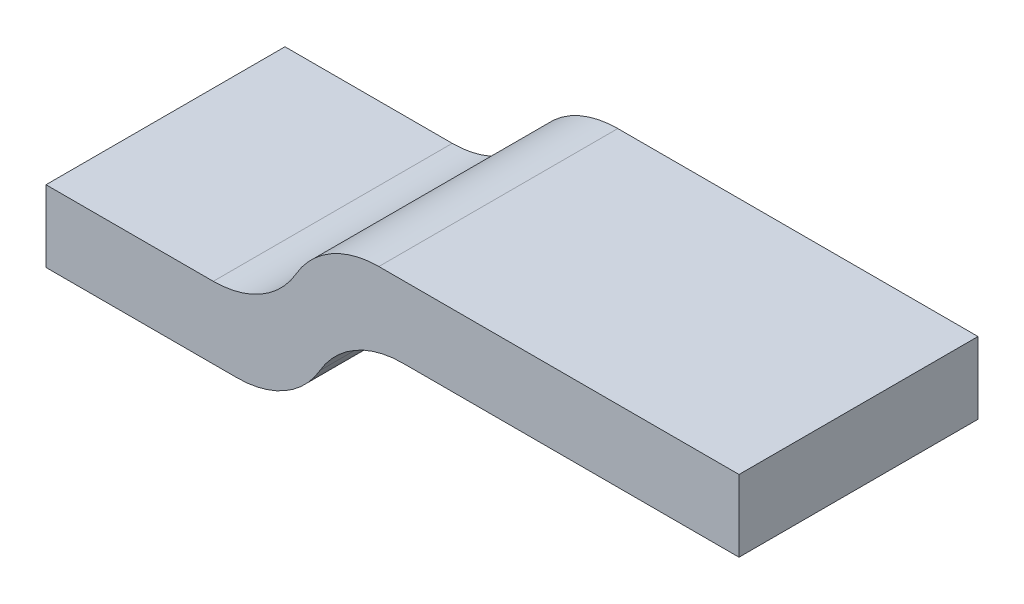
ISO-10303-21;
HEADER;
FILE_DESCRIPTION(('STEP AP214'),'2;1');
FILE_NAME('part.step','',(''),(''),'','','');
FILE_SCHEMA(('AUTOMOTIVE_DESIGN { 1 0 10303 214 1 1 1 1 }'));
ENDSEC;
DATA;
#1=APPLICATION_CONTEXT('core data for automotive mechanical design processes');
#2=APPLICATION_PROTOCOL_DEFINITION('international standard','automotive_design',2000,#1);
#3=PRODUCT_CONTEXT('',#1,'mechanical');
#4=PRODUCT('Part','Part','',(#3));
#5=PRODUCT_RELATED_PRODUCT_CATEGORY('part','',(#4));
#6=PRODUCT_DEFINITION_FORMATION('','',#4);
#7=PRODUCT_DEFINITION_CONTEXT('part definition',#1,'design');
#8=PRODUCT_DEFINITION('design','',#6,#7);
#9=PRODUCT_DEFINITION_SHAPE('','',#8);
#10=(LENGTH_UNIT() NAMED_UNIT(*) SI_UNIT(.MILLI.,.METRE.));
#11=(NAMED_UNIT(*) PLANE_ANGLE_UNIT() SI_UNIT($,.RADIAN.));
#12=(NAMED_UNIT(*) SI_UNIT($,.STERADIAN.) SOLID_ANGLE_UNIT());
#13=UNCERTAINTY_MEASURE_WITH_UNIT(LENGTH_MEASURE(1.E-05),#10,'distance_accuracy_value','');
#14=(GEOMETRIC_REPRESENTATION_CONTEXT(3) GLOBAL_UNCERTAINTY_ASSIGNED_CONTEXT((#13)) GLOBAL_UNIT_ASSIGNED_CONTEXT((#10,
#11,#12)) REPRESENTATION_CONTEXT('',''));
#15=CARTESIAN_POINT('',(0.,0.,0.));
#16=DIRECTION('',(0.,0.,1.));
#17=DIRECTION('',(1.,0.,0.));
#18=AXIS2_PLACEMENT_3D('',#15,#16,#17);
#19=CARTESIAN_POINT('',(-1.75,0.35,-1.6));
#20=DIRECTION('',(0.,-1.,0.));
#21=DIRECTION('',(0.,0.,-1.));
#22=AXIS2_PLACEMENT_3D('',#19,#20,#21);
#23=PLANE('',#22);
#24=DIRECTION('',(-1.,0.,0.));
#25=VECTOR('',#24,1.);
#26=CARTESIAN_POINT('',(-1.75,0.35,-2.1));
#27=LINE('',#26,#25);
#28=CARTESIAN_POINT('',(-1.75,0.35,-2.1));
#29=VERTEX_POINT('',#28);
#30=CARTESIAN_POINT('',(-2.50358983848623,0.35,-2.1));
#31=VERTEX_POINT('',#30);
#32=EDGE_CURVE('E11',#29,#31,#27,.T.);
#33=ORIENTED_EDGE('',*,*,#32,.T.);
#34=DIRECTION('',(0.,0.,-1.));
#35=VECTOR('',#34,1.);
#36=CARTESIAN_POINT('',(-2.50358983848623,0.35,-1.6));
#37=LINE('',#36,#35);
#38=CARTESIAN_POINT('',(-2.50358983848623,0.35,-1.6));
#39=VERTEX_POINT('',#38);
#40=EDGE_CURVE('E24',#39,#31,#37,.T.);
#41=ORIENTED_EDGE('',*,*,#40,.F.);
#42=DIRECTION('',(-1.,0.,0.));
#43=VECTOR('',#42,1.);
#44=CARTESIAN_POINT('',(-1.75,0.35,-1.6));
#45=LINE('',#44,#43);
#46=CARTESIAN_POINT('',(-1.75,0.35,-1.6));
#47=VERTEX_POINT('',#46);
#48=EDGE_CURVE('E171',#47,#39,#45,.T.);
#49=ORIENTED_EDGE('',*,*,#48,.F.);
#50=DIRECTION('',(0.,0.,-1.));
#51=VECTOR('',#50,1.);
#52=CARTESIAN_POINT('',(-1.75,0.35,-1.6));
#53=LINE('',#52,#51);
#54=EDGE_CURVE('E113',#47,#29,#53,.T.);
#55=ORIENTED_EDGE('',*,*,#54,.T.);
#56=EDGE_LOOP('',(#33,#41,#49,#55));
#57=FACE_BOUND('',#56,.T.);
#58=ADVANCED_FACE('F17',(#57),#23,.F.);
#59=CARTESIAN_POINT('',(-2.50358983848623,0.15,-1.6));
#60=DIRECTION('',(0.,0.,-1.));
#61=DIRECTION('',(-1.,0.,0.));
#62=AXIS2_PLACEMENT_3D('',#59,#60,#61);
#63=CYLINDRICAL_SURFACE('',#62,0.2);
#64=CARTESIAN_POINT('',(-2.50358983848623,0.15,-2.1));
#65=DIRECTION('',(0.,0.,1.));
#66=DIRECTION('',(1.,0.,0.));
#67=AXIS2_PLACEMENT_3D('',#64,#65,#66);
#68=CIRCLE('',#67,0.2);
#69=CARTESIAN_POINT('',(-2.67679491924312,0.25,-2.1));
#70=VERTEX_POINT('',#69);
#71=EDGE_CURVE('E168',#31,#70,#68,.T.);
#72=ORIENTED_EDGE('',*,*,#71,.T.);
#73=DIRECTION('',(0.,0.,-1.));
#74=VECTOR('',#73,1.);
#75=CARTESIAN_POINT('',(-2.67679491924312,0.25,-1.6));
#76=LINE('',#75,#74);
#77=CARTESIAN_POINT('',(-2.67679491924312,0.25,-1.6));
#78=VERTEX_POINT('',#77);
#79=EDGE_CURVE('E165',#78,#70,#76,.T.);
#80=ORIENTED_EDGE('',*,*,#79,.F.);
#81=CARTESIAN_POINT('',(-2.50358983848623,0.15,-1.6));
#82=DIRECTION('',(0.,0.,1.));
#83=DIRECTION('',(1.,0.,0.));
#84=AXIS2_PLACEMENT_3D('',#81,#82,#83);
#85=CIRCLE('',#84,0.2);
#86=EDGE_CURVE('E162',#39,#78,#85,.T.);
#87=ORIENTED_EDGE('',*,*,#86,.F.);
#88=ORIENTED_EDGE('',*,*,#40,.T.);
#89=EDGE_LOOP('',(#72,#80,#87,#88));
#90=FACE_BOUND('',#89,.T.);
#91=ADVANCED_FACE('F174',(#90),#63,.T.);
#92=CARTESIAN_POINT('',(-2.85,0.35,-1.6));
#93=DIRECTION('',(0.,0.,-1.));
#94=DIRECTION('',(-1.,0.,0.));
#95=AXIS2_PLACEMENT_3D('',#92,#93,#94);
#96=CYLINDRICAL_SURFACE('',#95,0.2);
#97=CARTESIAN_POINT('',(-2.85,0.35,-2.1));
#98=DIRECTION('',(0.,0.,-1.));
#99=DIRECTION('',(1.,0.,0.));
#100=AXIS2_PLACEMENT_3D('',#97,#98,#99);
#101=CIRCLE('',#100,0.2);
#102=CARTESIAN_POINT('',(-2.85,0.15,-2.1));
#103=VERTEX_POINT('',#102);
#104=EDGE_CURVE('E159',#70,#103,#101,.T.);
#105=ORIENTED_EDGE('',*,*,#104,.T.);
#106=DIRECTION('',(0.,0.,-1.));
#107=VECTOR('',#106,1.);
#108=CARTESIAN_POINT('',(-2.85,0.15,-1.6));
#109=LINE('',#108,#107);
#110=CARTESIAN_POINT('',(-2.85,0.15,-1.6));
#111=VERTEX_POINT('',#110);
#112=EDGE_CURVE('E157',#111,#103,#109,.T.);
#113=ORIENTED_EDGE('',*,*,#112,.F.);
#114=CARTESIAN_POINT('',(-2.85,0.35,-1.6));
#115=DIRECTION('',(0.,0.,-1.));
#116=DIRECTION('',(1.,0.,0.));
#117=AXIS2_PLACEMENT_3D('',#114,#115,#116);
#118=CIRCLE('',#117,0.2);
#119=EDGE_CURVE('E155',#78,#111,#118,.T.);
#120=ORIENTED_EDGE('',*,*,#119,.F.);
#121=ORIENTED_EDGE('',*,*,#79,.T.);
#122=EDGE_LOOP('',(#105,#113,#120,#121));
#123=FACE_BOUND('',#122,.T.);
#124=ADVANCED_FACE('F181',(#123),#96,.F.);
#125=CARTESIAN_POINT('',(-3.2,0.15,-1.6));
#126=DIRECTION('',(0.,-1.,0.));
#127=DIRECTION('',(0.,0.,-1.));
#128=AXIS2_PLACEMENT_3D('',#125,#126,#127);
#129=PLANE('',#128);
#130=DIRECTION('',(-1.,0.,0.));
#131=VECTOR('',#130,1.);
#132=CARTESIAN_POINT('',(-3.2,0.15,-2.1));
#133=LINE('',#132,#131);
#134=CARTESIAN_POINT('',(-3.2,0.15,-2.1));
#135=VERTEX_POINT('',#134);
#136=EDGE_CURVE('E153',#103,#135,#133,.T.);
#137=ORIENTED_EDGE('',*,*,#136,.T.);
#138=DIRECTION('',(0.,0.,-1.));
#139=VECTOR('',#138,1.);
#140=CARTESIAN_POINT('',(-3.2,0.15,-1.6));
#141=LINE('',#140,#139);
#142=CARTESIAN_POINT('',(-3.2,0.15,-1.6));
#143=VERTEX_POINT('',#142);
#144=EDGE_CURVE('E150',#143,#135,#141,.T.);
#145=ORIENTED_EDGE('',*,*,#144,.F.);
#146=DIRECTION('',(-1.,0.,0.));
#147=VECTOR('',#146,1.);
#148=CARTESIAN_POINT('',(-3.2,0.15,-1.6));
#149=LINE('',#148,#147);
#150=EDGE_CURVE('E147',#111,#143,#149,.T.);
#151=ORIENTED_EDGE('',*,*,#150,.F.);
#152=ORIENTED_EDGE('',*,*,#112,.T.);
#153=EDGE_LOOP('',(#137,#145,#151,#152));
#154=FACE_BOUND('',#153,.T.);
#155=ADVANCED_FACE('F199',(#154),#129,.F.);
#156=CARTESIAN_POINT('',(-3.2,0.15,-1.6));
#157=DIRECTION('',(1.,0.,0.));
#158=DIRECTION('',(0.,1.,0.));
#159=AXIS2_PLACEMENT_3D('',#156,#157,#158);
#160=PLANE('',#159);
#161=DIRECTION('',(0.,-1.,0.));
#162=VECTOR('',#161,1.);
#163=CARTESIAN_POINT('',(-3.2,0.15,-2.1));
#164=LINE('',#163,#162);
#165=CARTESIAN_POINT('',(-3.2,0.,-2.1));
#166=VERTEX_POINT('',#165);
#167=EDGE_CURVE('E145',#135,#166,#164,.T.);
#168=ORIENTED_EDGE('',*,*,#167,.T.);
#169=DIRECTION('',(0.,0.,-1.));
#170=VECTOR('',#169,1.);
#171=CARTESIAN_POINT('',(-3.2,0.,-1.6));
#172=LINE('',#171,#170);
#173=CARTESIAN_POINT('',(-3.2,0.,-1.6));
#174=VERTEX_POINT('',#173);
#175=EDGE_CURVE('E142',#174,#166,#172,.T.);
#176=ORIENTED_EDGE('',*,*,#175,.F.);
#177=DIRECTION('',(0.,-1.,0.));
#178=VECTOR('',#177,1.);
#179=CARTESIAN_POINT('',(-3.2,0.15,-1.6));
#180=LINE('',#179,#178);
#181=EDGE_CURVE('E139',#143,#174,#180,.T.);
#182=ORIENTED_EDGE('',*,*,#181,.F.);
#183=ORIENTED_EDGE('',*,*,#144,.T.);
#184=EDGE_LOOP('',(#168,#176,#182,#183));
#185=FACE_BOUND('',#184,.T.);
#186=ADVANCED_FACE('F197',(#185),#160,.F.);
#187=CARTESIAN_POINT('',(-3.2,0.,-1.6));
#188=DIRECTION('',(0.,1.,0.));
#189=DIRECTION('',(1.,0.,0.));
#190=AXIS2_PLACEMENT_3D('',#187,#188,#189);
#191=PLANE('',#190);
#192=DIRECTION('',(1.,0.,0.));
#193=VECTOR('',#192,1.);
#194=CARTESIAN_POINT('',(-3.2,0.,-2.1));
#195=LINE('',#194,#193);
#196=CARTESIAN_POINT('',(-2.8,0.,-2.1));
#197=VERTEX_POINT('',#196);
#198=EDGE_CURVE('E137',#166,#197,#195,.T.);
#199=ORIENTED_EDGE('',*,*,#198,.T.);
#200=DIRECTION('',(0.,0.,-1.));
#201=VECTOR('',#200,1.);
#202=CARTESIAN_POINT('',(-2.8,0.,-1.6));
#203=LINE('',#202,#201);
#204=CARTESIAN_POINT('',(-2.8,0.,-1.6));
#205=VERTEX_POINT('',#204);
#206=EDGE_CURVE('E134',#205,#197,#203,.T.);
#207=ORIENTED_EDGE('',*,*,#206,.F.);
#208=DIRECTION('',(1.,0.,0.));
#209=VECTOR('',#208,1.);
#210=CARTESIAN_POINT('',(-3.2,0.,-1.6));
#211=LINE('',#210,#209);
#212=EDGE_CURVE('E131',#174,#205,#211,.T.);
#213=ORIENTED_EDGE('',*,*,#212,.F.);
#214=ORIENTED_EDGE('',*,*,#175,.T.);
#215=EDGE_LOOP('',(#199,#207,#213,#214));
#216=FACE_BOUND('',#215,.T.);
#217=ADVANCED_FACE('F195',(#216),#191,.F.);
#218=CARTESIAN_POINT('',(-2.8,0.2,-1.6));
#219=DIRECTION('',(0.,0.,-1.));
#220=DIRECTION('',(-1.,0.,0.));
#221=AXIS2_PLACEMENT_3D('',#218,#219,#220);
#222=CYLINDRICAL_SURFACE('',#221,0.2);
#223=CARTESIAN_POINT('',(-2.8,0.2,-2.1));
#224=DIRECTION('',(0.,0.,1.));
#225=DIRECTION('',(1.,0.,0.));
#226=AXIS2_PLACEMENT_3D('',#223,#224,#225);
#227=CIRCLE('',#226,0.2);
#228=CARTESIAN_POINT('',(-2.62679491924311,0.1,-2.1));
#229=VERTEX_POINT('',#228);
#230=EDGE_CURVE('E129',#197,#229,#227,.T.);
#231=ORIENTED_EDGE('',*,*,#230,.T.);
#232=DIRECTION('',(0.,0.,-1.));
#233=VECTOR('',#232,1.);
#234=CARTESIAN_POINT('',(-2.62679491924311,0.1,-1.6));
#235=LINE('',#234,#233);
#236=CARTESIAN_POINT('',(-2.62679491924311,0.1,-1.6));
#237=VERTEX_POINT('',#236);
#238=EDGE_CURVE('E126',#237,#229,#235,.T.);
#239=ORIENTED_EDGE('',*,*,#238,.F.);
#240=CARTESIAN_POINT('',(-2.8,0.2,-1.6));
#241=DIRECTION('',(0.,0.,1.));
#242=DIRECTION('',(1.,0.,0.));
#243=AXIS2_PLACEMENT_3D('',#240,#241,#242);
#244=CIRCLE('',#243,0.2);
#245=EDGE_CURVE('E124',#205,#237,#244,.T.);
#246=ORIENTED_EDGE('',*,*,#245,.F.);
#247=ORIENTED_EDGE('',*,*,#206,.T.);
#248=EDGE_LOOP('',(#231,#239,#246,#247));
#249=FACE_BOUND('',#248,.T.);
#250=ADVANCED_FACE('F191',(#249),#222,.T.);
#251=CARTESIAN_POINT('',(-2.45358983848623,0.,-1.6));
#252=DIRECTION('',(0.,0.,-1.));
#253=DIRECTION('',(-1.,0.,0.));
#254=AXIS2_PLACEMENT_3D('',#251,#252,#253);
#255=CYLINDRICAL_SURFACE('',#254,0.2);
#256=CARTESIAN_POINT('',(-2.45358983848623,0.,-2.1));
#257=DIRECTION('',(0.,0.,-1.));
#258=DIRECTION('',(1.,0.,0.));
#259=AXIS2_PLACEMENT_3D('',#256,#257,#258);
#260=CIRCLE('',#259,0.2);
#261=CARTESIAN_POINT('',(-2.45358983848623,0.2,-2.1));
#262=VERTEX_POINT('',#261);
#263=EDGE_CURVE('E121',#229,#262,#260,.T.);
#264=ORIENTED_EDGE('',*,*,#263,.T.);
#265=DIRECTION('',(0.,0.,-1.));
#266=VECTOR('',#265,1.);
#267=CARTESIAN_POINT('',(-2.45358983848623,0.2,-1.6));
#268=LINE('',#267,#266);
#269=CARTESIAN_POINT('',(-2.45358983848623,0.2,-1.6));
#270=VERTEX_POINT('',#269);
#271=EDGE_CURVE('E119',#270,#262,#268,.T.);
#272=ORIENTED_EDGE('',*,*,#271,.F.);
#273=CARTESIAN_POINT('',(-2.45358983848623,0.,-1.6));
#274=DIRECTION('',(0.,0.,-1.));
#275=DIRECTION('',(1.,0.,0.));
#276=AXIS2_PLACEMENT_3D('',#273,#274,#275);
#277=CIRCLE('',#276,0.2);
#278=EDGE_CURVE('E107',#237,#270,#277,.T.);
#279=ORIENTED_EDGE('',*,*,#278,.F.);
#280=ORIENTED_EDGE('',*,*,#238,.T.);
#281=EDGE_LOOP('',(#264,#272,#279,#280));
#282=FACE_BOUND('',#281,.T.);
#283=ADVANCED_FACE('F188',(#282),#255,.F.);
#284=CARTESIAN_POINT('',(-1.75,0.2,-1.6));
#285=DIRECTION('',(0.,1.,0.));
#286=DIRECTION('',(1.,0.,0.));
#287=AXIS2_PLACEMENT_3D('',#284,#285,#286);
#288=PLANE('',#287);
#289=DIRECTION('',(1.,0.,0.));
#290=VECTOR('',#289,1.);
#291=CARTESIAN_POINT('',(-1.75,0.2,-2.1));
#292=LINE('',#291,#290);
#293=CARTESIAN_POINT('',(-1.75,0.2,-2.1));
#294=VERTEX_POINT('',#293);
#295=EDGE_CURVE('E95',#262,#294,#292,.T.);
#296=ORIENTED_EDGE('',*,*,#295,.T.);
#297=DIRECTION('',(0.,0.,-1.));
#298=VECTOR('',#297,1.);
#299=CARTESIAN_POINT('',(-1.75,0.2,-1.6));
#300=LINE('',#299,#298);
#301=CARTESIAN_POINT('',(-1.75,0.2,-1.6));
#302=VERTEX_POINT('',#301);
#303=EDGE_CURVE('E90',#302,#294,#300,.T.);
#304=ORIENTED_EDGE('',*,*,#303,.F.);
#305=DIRECTION('',(1.,0.,0.));
#306=VECTOR('',#305,1.);
#307=CARTESIAN_POINT('',(-1.75,0.2,-1.6));
#308=LINE('',#307,#306);
#309=EDGE_CURVE('E93',#270,#302,#308,.T.);
#310=ORIENTED_EDGE('',*,*,#309,.F.);
#311=ORIENTED_EDGE('',*,*,#271,.T.);
#312=EDGE_LOOP('',(#296,#304,#310,#311));
#313=FACE_BOUND('',#312,.T.);
#314=ADVANCED_FACE('F92',(#313),#288,.F.);
#315=CARTESIAN_POINT('',(-1.75,0.35,-1.6));
#316=DIRECTION('',(-1.,0.,0.));
#317=DIRECTION('',(0.,0.,1.));
#318=AXIS2_PLACEMENT_3D('',#315,#316,#317);
#319=PLANE('',#318);
#320=DIRECTION('',(0.,1.,0.));
#321=VECTOR('',#320,1.);
#322=CARTESIAN_POINT('',(-1.75,0.35,-2.1));
#323=LINE('',#322,#321);
#324=EDGE_CURVE('E109',#294,#29,#323,.T.);
#325=ORIENTED_EDGE('',*,*,#324,.T.);
#326=ORIENTED_EDGE('',*,*,#54,.F.);
#327=DIRECTION('',(0.,1.,0.));
#328=VECTOR('',#327,1.);
#329=CARTESIAN_POINT('',(-1.75,0.35,-1.6));
#330=LINE('',#329,#328);
#331=EDGE_CURVE('E104',#302,#47,#330,.T.);
#332=ORIENTED_EDGE('',*,*,#331,.F.);
#333=ORIENTED_EDGE('',*,*,#303,.T.);
#334=EDGE_LOOP('',(#325,#326,#332,#333));
#335=FACE_BOUND('',#334,.T.);
#336=ADVANCED_FACE('F112',(#335),#319,.F.);
#337=CARTESIAN_POINT('',(-2.50358983848623,0.15,-1.6));
#338=DIRECTION('',(0.,0.,1.));
#339=DIRECTION('',(1.,0.,0.));
#340=AXIS2_PLACEMENT_3D('',#337,#338,#339);
#341=PLANE('',#340);
#342=ORIENTED_EDGE('',*,*,#48,.T.);
#343=ORIENTED_EDGE('',*,*,#86,.T.);
#344=ORIENTED_EDGE('',*,*,#119,.T.);
#345=ORIENTED_EDGE('',*,*,#150,.T.);
#346=ORIENTED_EDGE('',*,*,#181,.T.);
#347=ORIENTED_EDGE('',*,*,#212,.T.);
#348=ORIENTED_EDGE('',*,*,#245,.T.);
#349=ORIENTED_EDGE('',*,*,#278,.T.);
#350=ORIENTED_EDGE('',*,*,#309,.T.);
#351=ORIENTED_EDGE('',*,*,#331,.T.);
#352=EDGE_LOOP('',(#342,#343,#344,#345,#346,#347,#348,#349,#350,#351));
#353=FACE_BOUND('',#352,.T.);
#354=ADVANCED_FACE('F103',(#353),#341,.T.);
#355=CARTESIAN_POINT('',(-2.50358983848623,0.15,-2.1));
#356=DIRECTION('',(0.,0.,1.));
#357=DIRECTION('',(1.,0.,0.));
#358=AXIS2_PLACEMENT_3D('',#355,#356,#357);
#359=PLANE('',#358);
#360=ORIENTED_EDGE('',*,*,#32,.F.);
#361=ORIENTED_EDGE('',*,*,#324,.F.);
#362=ORIENTED_EDGE('',*,*,#295,.F.);
#363=ORIENTED_EDGE('',*,*,#263,.F.);
#364=ORIENTED_EDGE('',*,*,#230,.F.);
#365=ORIENTED_EDGE('',*,*,#198,.F.);
#366=ORIENTED_EDGE('',*,*,#167,.F.);
#367=ORIENTED_EDGE('',*,*,#136,.F.);
#368=ORIENTED_EDGE('',*,*,#104,.F.);
#369=ORIENTED_EDGE('',*,*,#71,.F.);
#370=EDGE_LOOP('',(#360,#361,#362,#363,#364,#365,#366,#367,#368,#369));
#371=FACE_BOUND('',#370,.T.);
#372=ADVANCED_FACE('F176',(#371),#359,.F.);
#373=CLOSED_SHELL('',(#58,#91,#124,#155,#186,#217,#250,#283,#314,#336,#354,#372));
#374=MANIFOLD_SOLID_BREP('B1',#373);
#375=ADVANCED_BREP_SHAPE_REPRESENTATION('',(#18,#374),#14);
#376=SHAPE_DEFINITION_REPRESENTATION(#9,#375);
ENDSEC;
END-ISO-10303-21;
